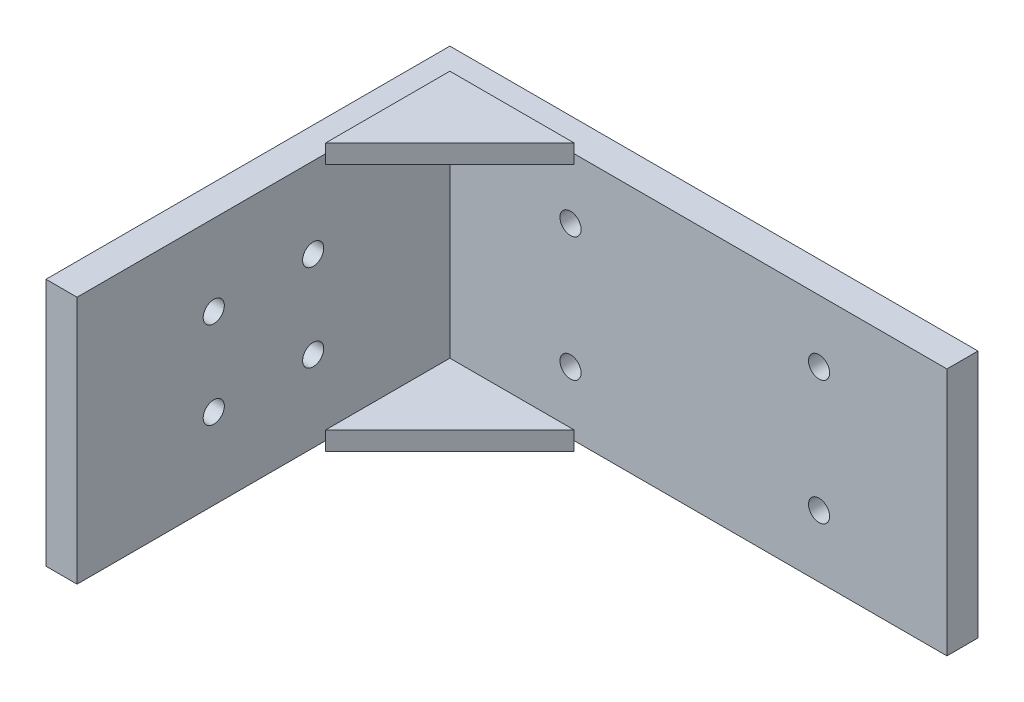
ISO-10303-21;
HEADER;
FILE_DESCRIPTION(('STEP AP214'),'2;1');
FILE_NAME('part.step','',(''),(''),'','','');
FILE_SCHEMA(('AUTOMOTIVE_DESIGN { 1 0 10303 214 1 1 1 1 }'));
ENDSEC;
DATA;
#1=APPLICATION_CONTEXT('core data for automotive mechanical design processes');
#2=APPLICATION_PROTOCOL_DEFINITION('international standard','automotive_design',2000,#1);
#3=PRODUCT_CONTEXT('',#1,'mechanical');
#4=PRODUCT('Part','Part','',(#3));
#5=PRODUCT_RELATED_PRODUCT_CATEGORY('part','',(#4));
#6=PRODUCT_DEFINITION_FORMATION('','',#4);
#7=PRODUCT_DEFINITION_CONTEXT('part definition',#1,'design');
#8=PRODUCT_DEFINITION('design','',#6,#7);
#9=PRODUCT_DEFINITION_SHAPE('','',#8);
#10=(LENGTH_UNIT() NAMED_UNIT(*) SI_UNIT(.MILLI.,.METRE.));
#11=(NAMED_UNIT(*) PLANE_ANGLE_UNIT() SI_UNIT($,.RADIAN.));
#12=(NAMED_UNIT(*) SI_UNIT($,.STERADIAN.) SOLID_ANGLE_UNIT());
#13=UNCERTAINTY_MEASURE_WITH_UNIT(LENGTH_MEASURE(1.E-05),#10,'distance_accuracy_value','');
#14=(GEOMETRIC_REPRESENTATION_CONTEXT(3) GLOBAL_UNCERTAINTY_ASSIGNED_CONTEXT((#13)) GLOBAL_UNIT_ASSIGNED_CONTEXT((#10,
#11,#12)) REPRESENTATION_CONTEXT('',''));
#15=CARTESIAN_POINT('',(0.,0.,0.));
#16=DIRECTION('',(0.,0.,1.));
#17=DIRECTION('',(1.,0.,0.));
#18=AXIS2_PLACEMENT_3D('',#15,#16,#17);
#19=CARTESIAN_POINT('',(0.,1.5,5.));
#20=DIRECTION('',(1.,0.,0.));
#21=DIRECTION('',(0.,0.,-1.));
#22=AXIS2_PLACEMENT_3D('',#19,#20,#21);
#23=PLANE('',#22);
#24=DIRECTION('',(0.,0.,1.));
#25=VECTOR('',#24,1.);
#26=CARTESIAN_POINT('',(0.,-1.5,5.));
#27=LINE('',#26,#25);
#28=CARTESIAN_POINT('',(0.,-1.5,5.));
#29=VERTEX_POINT('',#28);
#30=CARTESIAN_POINT('',(0.,-1.5,25.));
#31=VERTEX_POINT('',#30);
#32=EDGE_CURVE('E97',#29,#31,#27,.T.);
#33=ORIENTED_EDGE('',*,*,#32,.T.);
#34=DIRECTION('',(0.,-1.,0.));
#35=VECTOR('',#34,1.);
#36=CARTESIAN_POINT('',(0.,1.5,25.));
#37=LINE('',#36,#35);
#38=CARTESIAN_POINT('',(0.,1.5,25.));
#39=VERTEX_POINT('',#38);
#40=EDGE_CURVE('E12',#39,#31,#37,.T.);
#41=ORIENTED_EDGE('',*,*,#40,.F.);
#42=DIRECTION('',(0.,0.,1.));
#43=VECTOR('',#42,1.);
#44=CARTESIAN_POINT('',(0.,1.5,5.));
#45=LINE('',#44,#43);
#46=CARTESIAN_POINT('',(0.,1.5,5.));
#47=VERTEX_POINT('',#46);
#48=EDGE_CURVE('E89',#47,#39,#45,.T.);
#49=ORIENTED_EDGE('',*,*,#48,.F.);
#50=DIRECTION('',(0.,-1.,0.));
#51=VECTOR('',#50,1.);
#52=CARTESIAN_POINT('',(0.,1.5,5.));
#53=LINE('',#52,#51);
#54=EDGE_CURVE('E71',#47,#29,#53,.T.);
#55=ORIENTED_EDGE('',*,*,#54,.T.);
#56=EDGE_LOOP('',(#33,#41,#49,#55));
#57=FACE_BOUND('',#56,.T.);
#58=ADVANCED_FACE('F55',(#57),#23,.F.);
#59=CARTESIAN_POINT('',(20.,1.5,5.));
#60=DIRECTION('',(0.707106781186548,0.,0.707106781186547));
#61=DIRECTION('',(0.707106781186547,0.,-0.707106781186548));
#62=AXIS2_PLACEMENT_3D('',#59,#60,#61);
#63=PLANE('',#62);
#64=DIRECTION('',(-0.707106781186547,0.,0.707106781186548));
#65=VECTOR('',#64,1.);
#66=CARTESIAN_POINT('',(20.,-1.5,5.));
#67=LINE('',#66,#65);
#68=CARTESIAN_POINT('',(20.,-1.5,5.));
#69=VERTEX_POINT('',#68);
#70=EDGE_CURVE('E105',#69,#31,#67,.T.);
#71=ORIENTED_EDGE('',*,*,#70,.F.);
#72=DIRECTION('',(0.,-1.,0.));
#73=VECTOR('',#72,1.);
#74=CARTESIAN_POINT('',(20.,1.5,5.));
#75=LINE('',#74,#73);
#76=CARTESIAN_POINT('',(20.,1.5,5.));
#77=VERTEX_POINT('',#76);
#78=EDGE_CURVE('E63',#77,#69,#75,.T.);
#79=ORIENTED_EDGE('',*,*,#78,.F.);
#80=DIRECTION('',(-0.707106781186547,0.,0.707106781186548));
#81=VECTOR('',#80,1.);
#82=CARTESIAN_POINT('',(20.,1.5,5.));
#83=LINE('',#82,#81);
#84=EDGE_CURVE('E93',#77,#39,#83,.T.);
#85=ORIENTED_EDGE('',*,*,#84,.T.);
#86=ORIENTED_EDGE('',*,*,#40,.T.);
#87=EDGE_LOOP('',(#71,#79,#85,#86));
#88=FACE_BOUND('',#87,.T.);
#89=ADVANCED_FACE('F100',(#88),#63,.T.);
#90=CARTESIAN_POINT('',(0.,1.5,5.));
#91=DIRECTION('',(0.,0.,-1.));
#92=DIRECTION('',(-1.,0.,0.));
#93=AXIS2_PLACEMENT_3D('',#90,#91,#92);
#94=PLANE('',#93);
#95=DIRECTION('',(1.,0.,0.));
#96=VECTOR('',#95,1.);
#97=CARTESIAN_POINT('',(0.,-1.5,5.));
#98=LINE('',#97,#96);
#99=EDGE_CURVE('E95',#29,#69,#98,.T.);
#100=ORIENTED_EDGE('',*,*,#99,.F.);
#101=ORIENTED_EDGE('',*,*,#54,.F.);
#102=DIRECTION('',(1.,0.,0.));
#103=VECTOR('',#102,1.);
#104=CARTESIAN_POINT('',(0.,1.5,5.));
#105=LINE('',#104,#103);
#106=EDGE_CURVE('E94',#47,#77,#105,.T.);
#107=ORIENTED_EDGE('',*,*,#106,.T.);
#108=ORIENTED_EDGE('',*,*,#78,.T.);
#109=EDGE_LOOP('',(#100,#101,#107,#108));
#110=FACE_BOUND('',#109,.T.);
#111=ADVANCED_FACE('F111',(#110),#94,.T.);
#112=CARTESIAN_POINT('',(0.,1.5,0.));
#113=DIRECTION('',(0.,1.,0.));
#114=DIRECTION('',(0.,0.,1.));
#115=AXIS2_PLACEMENT_3D('',#112,#113,#114);
#116=PLANE('',#115);
#117=ORIENTED_EDGE('',*,*,#48,.T.);
#118=ORIENTED_EDGE('',*,*,#84,.F.);
#119=ORIENTED_EDGE('',*,*,#106,.F.);
#120=EDGE_LOOP('',(#117,#118,#119));
#121=FACE_BOUND('',#120,.T.);
#122=ADVANCED_FACE('F91',(#121),#116,.T.);
#123=CARTESIAN_POINT('',(0.,-1.5,0.));
#124=DIRECTION('',(0.,1.,0.));
#125=DIRECTION('',(0.,0.,1.));
#126=AXIS2_PLACEMENT_3D('',#123,#124,#125);
#127=PLANE('',#126);
#128=ORIENTED_EDGE('',*,*,#32,.F.);
#129=ORIENTED_EDGE('',*,*,#99,.T.);
#130=ORIENTED_EDGE('',*,*,#70,.T.);
#131=EDGE_LOOP('',(#128,#129,#130));
#132=FACE_BOUND('',#131,.T.);
#133=ADVANCED_FACE('F110',(#132),#127,.F.);
#134=CLOSED_SHELL('',(#58,#89,#111,#122,#133));
#135=MANIFOLD_SOLID_BREP('B2',#134);
#136=CARTESIAN_POINT('',(0.,0.,5.));
#137=DIRECTION('',(0.,0.,1.));
#138=DIRECTION('',(1.,0.,0.));
#139=AXIS2_PLACEMENT_3D('',#136,#137,#138);
#140=PLANE('',#139);
#141=CARTESIAN_POINT('',(19.4187387281831,-10.,5.));
#142=DIRECTION('',(0.,0.,1.));
#143=DIRECTION('',(1.,0.,0.));
#144=AXIS2_PLACEMENT_3D('',#141,#142,#143);
#145=CIRCLE('',#144,1.7);
#146=CARTESIAN_POINT('',(21.1187387281831,-10.,5.));
#147=VERTEX_POINT('',#146);
#148=EDGE_CURVE('E345',#147,#147,#145,.T.);
#149=ORIENTED_EDGE('',*,*,#148,.F.);
#150=EDGE_LOOP('',(#149));
#151=FACE_BOUND('',#150,.T.);
#152=CARTESIAN_POINT('',(19.4187387281831,-30.,5.));
#153=DIRECTION('',(0.,0.,1.));
#154=DIRECTION('',(1.,0.,0.));
#155=AXIS2_PLACEMENT_3D('',#152,#153,#154);
#156=CIRCLE('',#155,1.7);
#157=CARTESIAN_POINT('',(21.1187387281831,-30.,5.));
#158=VERTEX_POINT('',#157);
#159=EDGE_CURVE('E349',#158,#158,#156,.F.);
#160=ORIENTED_EDGE('',*,*,#159,.T.);
#161=EDGE_LOOP('',(#160));
#162=FACE_BOUND('',#161,.T.);
#163=CARTESIAN_POINT('',(59.4187387281831,-30.,5.));
#164=DIRECTION('',(0.,0.,1.));
#165=DIRECTION('',(1.,0.,0.));
#166=AXIS2_PLACEMENT_3D('',#163,#164,#165);
#167=CIRCLE('',#166,1.7);
#168=CARTESIAN_POINT('',(61.1187387281831,-30.,5.));
#169=VERTEX_POINT('',#168);
#170=EDGE_CURVE('E369',#169,#169,#167,.T.);
#171=ORIENTED_EDGE('',*,*,#170,.F.);
#172=EDGE_LOOP('',(#171));
#173=FACE_BOUND('',#172,.T.);
#174=CARTESIAN_POINT('',(59.4187387281831,-10.,5.));
#175=DIRECTION('',(0.,0.,1.));
#176=DIRECTION('',(1.,0.,0.));
#177=AXIS2_PLACEMENT_3D('',#174,#175,#176);
#178=CIRCLE('',#177,1.7);
#179=CARTESIAN_POINT('',(61.1187387281831,-10.,5.));
#180=VERTEX_POINT('',#179);
#181=EDGE_CURVE('E373',#180,#180,#178,.F.);
#182=ORIENTED_EDGE('',*,*,#181,.T.);
#183=EDGE_LOOP('',(#182));
#184=FACE_BOUND('',#183,.T.);
#185=DIRECTION('',(1.,0.,0.));
#186=VECTOR('',#185,1.);
#187=CARTESIAN_POINT('',(0.,-38.5,5.));
#188=LINE('',#187,#186);
#189=CARTESIAN_POINT('',(0.,-38.5,5.));
#190=VERTEX_POINT('',#189);
#191=CARTESIAN_POINT('',(20.,-38.5,5.));
#192=VERTEX_POINT('',#191);
#193=EDGE_CURVE('E169',#190,#192,#188,.T.);
#194=ORIENTED_EDGE('',*,*,#193,.T.);
#195=DIRECTION('',(0.,1.,0.));
#196=VECTOR('',#195,1.);
#197=CARTESIAN_POINT('',(20.,-41.5,5.));
#198=LINE('',#197,#196);
#199=CARTESIAN_POINT('',(20.,-40.,5.));
#200=VERTEX_POINT('',#199);
#201=EDGE_CURVE('E173',#200,#192,#198,.T.);
#202=ORIENTED_EDGE('',*,*,#201,.F.);
#203=DIRECTION('',(1.,0.,0.));
#204=VECTOR('',#203,1.);
#205=CARTESIAN_POINT('',(0.,-40.,5.));
#206=LINE('',#205,#204);
#207=CARTESIAN_POINT('',(80.,-40.,5.));
#208=VERTEX_POINT('',#207);
#209=EDGE_CURVE('E365',#200,#208,#206,.T.);
#210=ORIENTED_EDGE('',*,*,#209,.T.);
#211=DIRECTION('',(0.,-1.,0.));
#212=VECTOR('',#211,1.);
#213=CARTESIAN_POINT('',(80.,0.,5.));
#214=LINE('',#213,#212);
#215=CARTESIAN_POINT('',(80.,0.,5.));
#216=VERTEX_POINT('',#215);
#217=EDGE_CURVE('E354',#216,#208,#214,.T.);
#218=ORIENTED_EDGE('',*,*,#217,.F.);
#219=DIRECTION('',(1.,0.,0.));
#220=VECTOR('',#219,1.);
#221=CARTESIAN_POINT('',(0.,0.,5.));
#222=LINE('',#221,#220);
#223=CARTESIAN_POINT('',(0.,0.,5.));
#224=VERTEX_POINT('',#223);
#225=EDGE_CURVE('E358',#224,#216,#222,.T.);
#226=ORIENTED_EDGE('',*,*,#225,.F.);
#227=DIRECTION('',(0.,-1.,0.));
#228=VECTOR('',#227,1.);
#229=CARTESIAN_POINT('',(0.,0.,5.));
#230=LINE('',#229,#228);
#231=EDGE_CURVE('E362',#224,#190,#230,.T.);
#232=ORIENTED_EDGE('',*,*,#231,.T.);
#233=EDGE_LOOP('',(#194,#202,#210,#218,#226,#232));
#234=FACE_BOUND('',#233,.T.);
#235=ADVANCED_FACE('F153',(#151,#162,#173,#184,#234),#140,.T.);
#236=CARTESIAN_POINT('',(0.,0.,0.));
#237=DIRECTION('',(-1.,0.,0.));
#238=DIRECTION('',(0.,-1.,0.));
#239=AXIS2_PLACEMENT_3D('',#236,#237,#238);
#240=PLANE('',#239);
#241=DIRECTION('',(0.,1.,0.));
#242=VECTOR('',#241,1.);
#243=CARTESIAN_POINT('',(0.,0.,5.));
#244=LINE('',#243,#242);
#245=CARTESIAN_POINT('',(0.,-40.0044662647484,5.));
#246=VERTEX_POINT('',#245);
#247=CARTESIAN_POINT('',(0.,-40.,5.));
#248=VERTEX_POINT('',#247);
#249=EDGE_CURVE('E53',#246,#248,#244,.T.);
#250=ORIENTED_EDGE('',*,*,#249,.F.);
#251=DIRECTION('',(0.,0.,1.));
#252=VECTOR('',#251,1.);
#253=CARTESIAN_POINT('',(0.,-40.0044662647484,0.));
#254=LINE('',#253,#252);
#255=CARTESIAN_POINT('',(0.,-40.0044662647484,0.));
#256=VERTEX_POINT('',#255);
#257=EDGE_CURVE('E323',#256,#246,#254,.T.);
#258=ORIENTED_EDGE('',*,*,#257,.F.);
#259=DIRECTION('',(0.,-1.,0.));
#260=VECTOR('',#259,1.);
#261=CARTESIAN_POINT('',(0.,0.,0.));
#262=LINE('',#261,#260);
#263=CARTESIAN_POINT('',(0.,-40.,0.));
#264=VERTEX_POINT('',#263);
#265=EDGE_CURVE('E303',#264,#256,#262,.T.);
#266=ORIENTED_EDGE('',*,*,#265,.F.);
#267=DIRECTION('',(0.,0.,-1.));
#268=VECTOR('',#267,1.);
#269=CARTESIAN_POINT('',(0.,-40.,5.));
#270=LINE('',#269,#268);
#271=EDGE_CURVE('E406',#248,#264,#270,.T.);
#272=ORIENTED_EDGE('',*,*,#271,.F.);
#273=EDGE_LOOP('',(#250,#258,#266,#272));
#274=FACE_BOUND('',#273,.T.);
#275=ADVANCED_FACE('F446',(#274),#240,.F.);
#276=CARTESIAN_POINT('',(0.,-13.0022331323742,43.));
#277=DIRECTION('',(1.,0.,0.));
#278=DIRECTION('',(0.,1.,0.));
#279=AXIS2_PLACEMENT_3D('',#276,#277,#278);
#280=CIRCLE('',#279,1.7);
#281=CARTESIAN_POINT('',(0.,-11.3022331323742,43.));
#282=VERTEX_POINT('',#281);
#283=EDGE_CURVE('E280',#282,#282,#280,.T.);
#284=ORIENTED_EDGE('',*,*,#283,.F.);
#285=EDGE_LOOP('',(#284));
#286=FACE_BOUND('',#285,.T.);
#287=CARTESIAN_POINT('',(0.,-13.0022331323742,27.));
#288=DIRECTION('',(1.,0.,0.));
#289=DIRECTION('',(0.,-1.,0.));
#290=AXIS2_PLACEMENT_3D('',#287,#288,#289);
#291=CIRCLE('',#290,1.7);
#292=CARTESIAN_POINT('',(0.,-14.7022331323742,27.));
#293=VERTEX_POINT('',#292);
#294=EDGE_CURVE('E276',#293,#293,#291,.T.);
#295=ORIENTED_EDGE('',*,*,#294,.F.);
#296=EDGE_LOOP('',(#295));
#297=FACE_BOUND('',#296,.T.);
#298=CARTESIAN_POINT('',(0.,-27.0022331323742,27.));
#299=DIRECTION('',(1.,0.,0.));
#300=DIRECTION('',(0.,1.,0.));
#301=AXIS2_PLACEMENT_3D('',#298,#299,#300);
#302=CIRCLE('',#301,1.7);
#303=CARTESIAN_POINT('',(0.,-25.3022331323742,27.));
#304=VERTEX_POINT('',#303);
#305=EDGE_CURVE('E271',#304,#304,#302,.T.);
#306=ORIENTED_EDGE('',*,*,#305,.F.);
#307=EDGE_LOOP('',(#306));
#308=FACE_BOUND('',#307,.T.);
#309=CARTESIAN_POINT('',(0.,-27.0022331323742,43.));
#310=DIRECTION('',(1.,0.,0.));
#311=DIRECTION('',(0.,-1.,0.));
#312=AXIS2_PLACEMENT_3D('',#309,#310,#311);
#313=CIRCLE('',#312,1.7);
#314=CARTESIAN_POINT('',(0.,-28.7022331323742,43.));
#315=VERTEX_POINT('',#314);
#316=EDGE_CURVE('E266',#315,#315,#313,.T.);
#317=ORIENTED_EDGE('',*,*,#316,.F.);
#318=EDGE_LOOP('',(#317));
#319=FACE_BOUND('',#318,.T.);
#320=DIRECTION('',(0.,-1.,0.));
#321=VECTOR('',#320,1.);
#322=CARTESIAN_POINT('',(0.,0.,25.));
#323=LINE('',#322,#321);
#324=CARTESIAN_POINT('',(0.,-38.5,25.));
#325=VERTEX_POINT('',#324);
#326=CARTESIAN_POINT('',(0.,-40.0044662647484,25.));
#327=VERTEX_POINT('',#326);
#328=EDGE_CURVE('E162',#325,#327,#323,.T.);
#329=ORIENTED_EDGE('',*,*,#328,.F.);
#330=DIRECTION('',(0.,0.,-1.));
#331=VECTOR('',#330,1.);
#332=CARTESIAN_POINT('',(0.,-38.5,25.));
#333=LINE('',#332,#331);
#334=EDGE_CURVE('E430',#325,#190,#333,.T.);
#335=ORIENTED_EDGE('',*,*,#334,.T.);
#336=ORIENTED_EDGE('',*,*,#231,.F.);
#337=DIRECTION('',(0.,0.,-1.));
#338=VECTOR('',#337,1.);
#339=CARTESIAN_POINT('',(0.,0.,0.));
#340=LINE('',#339,#338);
#341=CARTESIAN_POINT('',(0.,0.,65.));
#342=VERTEX_POINT('',#341);
#343=EDGE_CURVE('E309',#342,#224,#340,.T.);
#344=ORIENTED_EDGE('',*,*,#343,.F.);
#345=DIRECTION('',(0.,1.,0.));
#346=VECTOR('',#345,1.);
#347=CARTESIAN_POINT('',(0.,0.,65.));
#348=LINE('',#347,#346);
#349=CARTESIAN_POINT('',(0.,-40.0044662647484,65.));
#350=VERTEX_POINT('',#349);
#351=EDGE_CURVE('E327',#350,#342,#348,.T.);
#352=ORIENTED_EDGE('',*,*,#351,.F.);
#353=EDGE_CURVE('E322',#327,#350,#254,.T.);
#354=ORIENTED_EDGE('',*,*,#353,.F.);
#355=EDGE_LOOP('',(#329,#335,#336,#344,#352,#354));
#356=FACE_BOUND('',#355,.T.);
#357=ADVANCED_FACE('F432',(#286,#297,#308,#319,#356),#240,.F.);
#358=CARTESIAN_POINT('',(80.,0.,5.));
#359=DIRECTION('',(1.,0.,0.));
#360=DIRECTION('',(0.,0.,-1.));
#361=AXIS2_PLACEMENT_3D('',#358,#359,#360);
#362=PLANE('',#361);
#363=DIRECTION('',(0.,-1.,0.));
#364=VECTOR('',#363,1.);
#365=CARTESIAN_POINT('',(80.,0.,0.));
#366=LINE('',#365,#364);
#367=CARTESIAN_POINT('',(80.,0.,0.));
#368=VERTEX_POINT('',#367);
#369=CARTESIAN_POINT('',(80.,-40.,0.));
#370=VERTEX_POINT('',#369);
#371=EDGE_CURVE('E385',#368,#370,#366,.T.);
#372=ORIENTED_EDGE('',*,*,#371,.F.);
#373=DIRECTION('',(0.,0.,-1.));
#374=VECTOR('',#373,1.);
#375=CARTESIAN_POINT('',(80.,0.,5.));
#376=LINE('',#375,#374);
#377=EDGE_CURVE('E410',#216,#368,#376,.T.);
#378=ORIENTED_EDGE('',*,*,#377,.F.);
#379=ORIENTED_EDGE('',*,*,#217,.T.);
#380=DIRECTION('',(0.,0.,-1.));
#381=VECTOR('',#380,1.);
#382=CARTESIAN_POINT('',(80.,-40.,5.));
#383=LINE('',#382,#381);
#384=EDGE_CURVE('E377',#208,#370,#383,.T.);
#385=ORIENTED_EDGE('',*,*,#384,.T.);
#386=EDGE_LOOP('',(#372,#378,#379,#385));
#387=FACE_BOUND('',#386,.T.);
#388=ADVANCED_FACE('F481',(#387),#362,.T.);
#389=CARTESIAN_POINT('',(0.,0.,5.));
#390=DIRECTION('',(0.,1.,0.));
#391=DIRECTION('',(0.,0.,1.));
#392=AXIS2_PLACEMENT_3D('',#389,#390,#391);
#393=PLANE('',#392);
#394=DIRECTION('',(1.,0.,0.));
#395=VECTOR('',#394,1.);
#396=CARTESIAN_POINT('',(0.,0.,0.));
#397=LINE('',#396,#395);
#398=CARTESIAN_POINT('',(-5.,0.,0.));
#399=VERTEX_POINT('',#398);
#400=EDGE_CURVE('E389',#399,#368,#397,.T.);
#401=ORIENTED_EDGE('',*,*,#400,.F.);
#402=DIRECTION('',(0.,0.,-1.));
#403=VECTOR('',#402,1.);
#404=CARTESIAN_POINT('',(-5.,0.,0.));
#405=LINE('',#404,#403);
#406=CARTESIAN_POINT('',(-5.,0.,65.));
#407=VERTEX_POINT('',#406);
#408=EDGE_CURVE('E315',#407,#399,#405,.T.);
#409=ORIENTED_EDGE('',*,*,#408,.F.);
#410=DIRECTION('',(1.,0.,0.));
#411=VECTOR('',#410,1.);
#412=CARTESIAN_POINT('',(-5.,0.,65.));
#413=LINE('',#412,#411);
#414=EDGE_CURVE('E319',#407,#342,#413,.T.);
#415=ORIENTED_EDGE('',*,*,#414,.T.);
#416=ORIENTED_EDGE('',*,*,#343,.T.);
#417=ORIENTED_EDGE('',*,*,#225,.T.);
#418=ORIENTED_EDGE('',*,*,#377,.T.);
#419=EDGE_LOOP('',(#401,#409,#415,#416,#417,#418));
#420=FACE_BOUND('',#419,.T.);
#421=ADVANCED_FACE('F473',(#420),#393,.T.);
#422=CARTESIAN_POINT('',(59.4187387281831,-30.,5.));
#423=DIRECTION('',(0.,0.,-1.));
#424=DIRECTION('',(-1.,0.,0.));
#425=AXIS2_PLACEMENT_3D('',#422,#423,#424);
#426=CYLINDRICAL_SURFACE('',#425,1.7);
#427=ORIENTED_EDGE('',*,*,#170,.T.);
#428=EDGE_LOOP('',(#427));
#429=FACE_BOUND('',#428,.T.);
#430=CARTESIAN_POINT('',(59.4187387281831,-30.,0.));
#431=DIRECTION('',(0.,0.,1.));
#432=DIRECTION('',(1.,0.,0.));
#433=AXIS2_PLACEMENT_3D('',#430,#431,#432);
#434=CIRCLE('',#433,1.7);
#435=CARTESIAN_POINT('',(61.1187387281831,-30.,0.));
#436=VERTEX_POINT('',#435);
#437=EDGE_CURVE('E397',#436,#436,#434,.T.);
#438=ORIENTED_EDGE('',*,*,#437,.F.);
#439=EDGE_LOOP('',(#438));
#440=FACE_BOUND('',#439,.T.);
#441=ADVANCED_FACE('F469',(#429,#440),#426,.F.);
#442=CARTESIAN_POINT('',(0.,-40.,5.));
#443=DIRECTION('',(0.,1.,0.));
#444=DIRECTION('',(0.,0.,1.));
#445=AXIS2_PLACEMENT_3D('',#442,#443,#444);
#446=PLANE('',#445);
#447=DIRECTION('',(1.,0.,0.));
#448=VECTOR('',#447,1.);
#449=CARTESIAN_POINT('',(0.,-40.,0.));
#450=LINE('',#449,#448);
#451=EDGE_CURVE('E393',#264,#370,#450,.T.);
#452=ORIENTED_EDGE('',*,*,#451,.T.);
#453=ORIENTED_EDGE('',*,*,#384,.F.);
#454=ORIENTED_EDGE('',*,*,#209,.F.);
#455=EDGE_CURVE('E366',#248,#200,#206,.T.);
#456=ORIENTED_EDGE('',*,*,#455,.F.);
#457=ORIENTED_EDGE('',*,*,#271,.T.);
#458=EDGE_LOOP('',(#452,#453,#454,#456,#457));
#459=FACE_BOUND('',#458,.T.);
#460=ADVANCED_FACE('F472',(#459),#446,.F.);
#461=CARTESIAN_POINT('',(19.4187387281831,-30.,5.));
#462=DIRECTION('',(0.,0.,-1.));
#463=DIRECTION('',(-1.,0.,0.));
#464=AXIS2_PLACEMENT_3D('',#461,#462,#463);
#465=CYLINDRICAL_SURFACE('',#464,1.7);
#466=ORIENTED_EDGE('',*,*,#159,.F.);
#467=EDGE_LOOP('',(#466));
#468=FACE_BOUND('',#467,.T.);
#469=CARTESIAN_POINT('',(19.4187387281831,-30.,0.));
#470=DIRECTION('',(0.,0.,1.));
#471=DIRECTION('',(1.,0.,0.));
#472=AXIS2_PLACEMENT_3D('',#469,#470,#471);
#473=CIRCLE('',#472,1.7);
#474=CARTESIAN_POINT('',(21.1187387281831,-30.,0.));
#475=VERTEX_POINT('',#474);
#476=EDGE_CURVE('E381',#475,#475,#473,.F.);
#477=ORIENTED_EDGE('',*,*,#476,.T.);
#478=EDGE_LOOP('',(#477));
#479=FACE_BOUND('',#478,.T.);
#480=ADVANCED_FACE('F477',(#468,#479),#465,.F.);
#481=CARTESIAN_POINT('',(19.4187387281831,-10.,5.));
#482=DIRECTION('',(0.,0.,-1.));
#483=DIRECTION('',(-1.,0.,0.));
#484=AXIS2_PLACEMENT_3D('',#481,#482,#483);
#485=CYLINDRICAL_SURFACE('',#484,1.7);
#486=ORIENTED_EDGE('',*,*,#148,.T.);
#487=EDGE_LOOP('',(#486));
#488=FACE_BOUND('',#487,.T.);
#489=CARTESIAN_POINT('',(19.4187387281831,-10.,0.));
#490=DIRECTION('',(0.,0.,1.));
#491=DIRECTION('',(1.,0.,0.));
#492=AXIS2_PLACEMENT_3D('',#489,#490,#491);
#493=CIRCLE('',#492,1.7);
#494=CARTESIAN_POINT('',(21.1187387281831,-10.,0.));
#495=VERTEX_POINT('',#494);
#496=EDGE_CURVE('E344',#495,#495,#493,.T.);
#497=ORIENTED_EDGE('',*,*,#496,.F.);
#498=EDGE_LOOP('',(#497));
#499=FACE_BOUND('',#498,.T.);
#500=ADVANCED_FACE('F155',(#488,#499),#485,.F.);
#501=CARTESIAN_POINT('',(59.4187387281831,-10.,5.));
#502=DIRECTION('',(0.,0.,-1.));
#503=DIRECTION('',(-1.,0.,0.));
#504=AXIS2_PLACEMENT_3D('',#501,#502,#503);
#505=CYLINDRICAL_SURFACE('',#504,1.7);
#506=ORIENTED_EDGE('',*,*,#181,.F.);
#507=EDGE_LOOP('',(#506));
#508=FACE_BOUND('',#507,.T.);
#509=CARTESIAN_POINT('',(59.4187387281831,-10.,0.));
#510=DIRECTION('',(0.,0.,1.));
#511=DIRECTION('',(1.,0.,0.));
#512=AXIS2_PLACEMENT_3D('',#509,#510,#511);
#513=CIRCLE('',#512,1.7);
#514=CARTESIAN_POINT('',(61.1187387281831,-10.,0.));
#515=VERTEX_POINT('',#514);
#516=EDGE_CURVE('E350',#515,#515,#513,.F.);
#517=ORIENTED_EDGE('',*,*,#516,.T.);
#518=EDGE_LOOP('',(#517));
#519=FACE_BOUND('',#518,.T.);
#520=ADVANCED_FACE('F464',(#508,#519),#505,.F.);
#521=CARTESIAN_POINT('',(0.,0.,0.));
#522=DIRECTION('',(0.,0.,1.));
#523=DIRECTION('',(1.,0.,0.));
#524=AXIS2_PLACEMENT_3D('',#521,#522,#523);
#525=PLANE('',#524);
#526=ORIENTED_EDGE('',*,*,#496,.T.);
#527=EDGE_LOOP('',(#526));
#528=FACE_BOUND('',#527,.T.);
#529=ORIENTED_EDGE('',*,*,#476,.F.);
#530=EDGE_LOOP('',(#529));
#531=FACE_BOUND('',#530,.T.);
#532=ORIENTED_EDGE('',*,*,#371,.T.);
#533=ORIENTED_EDGE('',*,*,#451,.F.);
#534=ORIENTED_EDGE('',*,*,#265,.T.);
#535=DIRECTION('',(1.,0.,0.));
#536=VECTOR('',#535,1.);
#537=CARTESIAN_POINT('',(-4.99999999999999,-40.0044662647484,0.));
#538=LINE('',#537,#536);
#539=CARTESIAN_POINT('',(-4.99999999999999,-40.0044662647484,0.));
#540=VERTEX_POINT('',#539);
#541=EDGE_CURVE('E340',#540,#256,#538,.T.);
#542=ORIENTED_EDGE('',*,*,#541,.F.);
#543=DIRECTION('',(0.,-1.,0.));
#544=VECTOR('',#543,1.);
#545=CARTESIAN_POINT('',(-5.,0.,0.));
#546=LINE('',#545,#544);
#547=EDGE_CURVE('E304',#399,#540,#546,.T.);
#548=ORIENTED_EDGE('',*,*,#547,.F.);
#549=ORIENTED_EDGE('',*,*,#400,.T.);
#550=EDGE_LOOP('',(#532,#533,#534,#542,#548,#549));
#551=FACE_BOUND('',#550,.T.);
#552=ORIENTED_EDGE('',*,*,#437,.T.);
#553=EDGE_LOOP('',(#552));
#554=FACE_BOUND('',#553,.T.);
#555=ORIENTED_EDGE('',*,*,#516,.F.);
#556=EDGE_LOOP('',(#555));
#557=FACE_BOUND('',#556,.T.);
#558=ADVANCED_FACE('F461',(#528,#531,#551,#554,#557),#525,.F.);
#559=CARTESIAN_POINT('',(-4.99999999999999,-40.0044662647484,0.));
#560=DIRECTION('',(0.,1.,0.));
#561=DIRECTION('',(-1.,0.,0.));
#562=AXIS2_PLACEMENT_3D('',#559,#560,#561);
#563=PLANE('',#562);
#564=ORIENTED_EDGE('',*,*,#257,.T.);
#565=EDGE_CURVE('E264',#246,#327,#254,.T.);
#566=ORIENTED_EDGE('',*,*,#565,.T.);
#567=ORIENTED_EDGE('',*,*,#353,.T.);
#568=DIRECTION('',(1.,0.,0.));
#569=VECTOR('',#568,1.);
#570=CARTESIAN_POINT('',(-4.99999999999999,-40.0044662647484,65.));
#571=LINE('',#570,#569);
#572=CARTESIAN_POINT('',(-4.99999999999999,-40.0044662647484,65.));
#573=VERTEX_POINT('',#572);
#574=EDGE_CURVE('E336',#573,#350,#571,.T.);
#575=ORIENTED_EDGE('',*,*,#574,.F.);
#576=DIRECTION('',(0.,0.,1.));
#577=VECTOR('',#576,1.);
#578=CARTESIAN_POINT('',(-4.99999999999999,-40.0044662647484,0.));
#579=LINE('',#578,#577);
#580=EDGE_CURVE('E308',#540,#573,#579,.T.);
#581=ORIENTED_EDGE('',*,*,#580,.F.);
#582=ORIENTED_EDGE('',*,*,#541,.T.);
#583=EDGE_LOOP('',(#564,#566,#567,#575,#581,#582));
#584=FACE_BOUND('',#583,.T.);
#585=ADVANCED_FACE('F459',(#584),#563,.F.);
#586=CARTESIAN_POINT('',(-5.,0.,65.));
#587=DIRECTION('',(0.,0.,-1.));
#588=DIRECTION('',(0.,1.,0.));
#589=AXIS2_PLACEMENT_3D('',#586,#587,#588);
#590=PLANE('',#589);
#591=ORIENTED_EDGE('',*,*,#351,.T.);
#592=ORIENTED_EDGE('',*,*,#414,.F.);
#593=DIRECTION('',(0.,1.,0.));
#594=VECTOR('',#593,1.);
#595=CARTESIAN_POINT('',(-5.,0.,65.));
#596=LINE('',#595,#594);
#597=EDGE_CURVE('E312',#573,#407,#596,.T.);
#598=ORIENTED_EDGE('',*,*,#597,.F.);
#599=ORIENTED_EDGE('',*,*,#574,.T.);
#600=EDGE_LOOP('',(#591,#592,#598,#599));
#601=FACE_BOUND('',#600,.T.);
#602=ADVANCED_FACE('F518',(#601),#590,.F.);
#603=CARTESIAN_POINT('',(-5.,0.,0.));
#604=DIRECTION('',(-1.,0.,0.));
#605=DIRECTION('',(0.,-1.,0.));
#606=AXIS2_PLACEMENT_3D('',#603,#604,#605);
#607=PLANE('',#606);
#608=CARTESIAN_POINT('',(-5.,-27.0022331323742,43.));
#609=DIRECTION('',(-1.,0.,0.));
#610=DIRECTION('',(0.,-1.,0.));
#611=AXIS2_PLACEMENT_3D('',#608,#609,#610);
#612=CIRCLE('',#611,1.7);
#613=CARTESIAN_POINT('',(-5.,-28.7022331323742,43.));
#614=VERTEX_POINT('',#613);
#615=EDGE_CURVE('E299',#614,#614,#612,.T.);
#616=ORIENTED_EDGE('',*,*,#615,.F.);
#617=EDGE_LOOP('',(#616));
#618=FACE_BOUND('',#617,.T.);
#619=CARTESIAN_POINT('',(-5.,-27.0022331323742,27.));
#620=DIRECTION('',(-1.,0.,0.));
#621=DIRECTION('',(0.,-1.,0.));
#622=AXIS2_PLACEMENT_3D('',#619,#620,#621);
#623=CIRCLE('',#622,1.7);
#624=CARTESIAN_POINT('',(-5.,-28.7022331323742,27.));
#625=VERTEX_POINT('',#624);
#626=EDGE_CURVE('E295',#625,#625,#623,.T.);
#627=ORIENTED_EDGE('',*,*,#626,.F.);
#628=EDGE_LOOP('',(#627));
#629=FACE_BOUND('',#628,.T.);
#630=CARTESIAN_POINT('',(-5.,-13.0022331323742,27.));
#631=DIRECTION('',(-1.,0.,0.));
#632=DIRECTION('',(0.,-1.,0.));
#633=AXIS2_PLACEMENT_3D('',#630,#631,#632);
#634=CIRCLE('',#633,1.7);
#635=CARTESIAN_POINT('',(-5.,-14.7022331323742,27.));
#636=VERTEX_POINT('',#635);
#637=EDGE_CURVE('E291',#636,#636,#634,.T.);
#638=ORIENTED_EDGE('',*,*,#637,.F.);
#639=EDGE_LOOP('',(#638));
#640=FACE_BOUND('',#639,.T.);
#641=CARTESIAN_POINT('',(-5.,-13.0022331323742,43.));
#642=DIRECTION('',(-1.,0.,0.));
#643=DIRECTION('',(0.,-1.,0.));
#644=AXIS2_PLACEMENT_3D('',#641,#642,#643);
#645=CIRCLE('',#644,1.7);
#646=CARTESIAN_POINT('',(-5.,-14.7022331323742,43.));
#647=VERTEX_POINT('',#646);
#648=EDGE_CURVE('E287',#647,#647,#645,.T.);
#649=ORIENTED_EDGE('',*,*,#648,.F.);
#650=EDGE_LOOP('',(#649));
#651=FACE_BOUND('',#650,.T.);
#652=ORIENTED_EDGE('',*,*,#547,.T.);
#653=ORIENTED_EDGE('',*,*,#580,.T.);
#654=ORIENTED_EDGE('',*,*,#597,.T.);
#655=ORIENTED_EDGE('',*,*,#408,.T.);
#656=EDGE_LOOP('',(#652,#653,#654,#655));
#657=FACE_BOUND('',#656,.T.);
#658=ADVANCED_FACE('F513',(#618,#629,#640,#651,#657),#607,.T.);
#659=CARTESIAN_POINT('',(-10.,-13.0022331323742,43.));
#660=DIRECTION('',(1.,0.,0.));
#661=DIRECTION('',(0.,1.,0.));
#662=AXIS2_PLACEMENT_3D('',#659,#660,#661);
#663=CYLINDRICAL_SURFACE('',#662,1.7);
#664=ORIENTED_EDGE('',*,*,#648,.T.);
#665=EDGE_LOOP('',(#664));
#666=FACE_BOUND('',#665,.T.);
#667=ORIENTED_EDGE('',*,*,#283,.T.);
#668=EDGE_LOOP('',(#667));
#669=FACE_BOUND('',#668,.T.);
#670=ADVANCED_FACE('F523',(#666,#669),#663,.F.);
#671=CARTESIAN_POINT('',(-10.,-13.0022331323742,27.));
#672=DIRECTION('',(1.,0.,0.));
#673=DIRECTION('',(0.,1.,0.));
#674=AXIS2_PLACEMENT_3D('',#671,#672,#673);
#675=CYLINDRICAL_SURFACE('',#674,1.7);
#676=ORIENTED_EDGE('',*,*,#637,.T.);
#677=EDGE_LOOP('',(#676));
#678=FACE_BOUND('',#677,.T.);
#679=ORIENTED_EDGE('',*,*,#294,.T.);
#680=EDGE_LOOP('',(#679));
#681=FACE_BOUND('',#680,.T.);
#682=ADVANCED_FACE('F530',(#678,#681),#675,.F.);
#683=CARTESIAN_POINT('',(-10.,-27.0022331323742,27.));
#684=DIRECTION('',(1.,0.,0.));
#685=DIRECTION('',(0.,1.,0.));
#686=AXIS2_PLACEMENT_3D('',#683,#684,#685);
#687=CYLINDRICAL_SURFACE('',#686,1.7);
#688=ORIENTED_EDGE('',*,*,#626,.T.);
#689=EDGE_LOOP('',(#688));
#690=FACE_BOUND('',#689,.T.);
#691=ORIENTED_EDGE('',*,*,#305,.T.);
#692=EDGE_LOOP('',(#691));
#693=FACE_BOUND('',#692,.T.);
#694=ADVANCED_FACE('F534',(#690,#693),#687,.F.);
#695=CARTESIAN_POINT('',(-10.,-27.0022331323742,43.));
#696=DIRECTION('',(1.,0.,0.));
#697=DIRECTION('',(0.,1.,0.));
#698=AXIS2_PLACEMENT_3D('',#695,#696,#697);
#699=CYLINDRICAL_SURFACE('',#698,1.7);
#700=ORIENTED_EDGE('',*,*,#615,.T.);
#701=EDGE_LOOP('',(#700));
#702=FACE_BOUND('',#701,.T.);
#703=ORIENTED_EDGE('',*,*,#316,.T.);
#704=EDGE_LOOP('',(#703));
#705=FACE_BOUND('',#704,.T.);
#706=ADVANCED_FACE('F532',(#702,#705),#699,.F.);
#707=CARTESIAN_POINT('',(0.,-41.5,25.));
#708=DIRECTION('',(1.,0.,0.));
#709=DIRECTION('',(0.,0.,-1.));
#710=AXIS2_PLACEMENT_3D('',#707,#708,#709);
#711=PLANE('',#710);
#712=DIRECTION('',(0.,1.,0.));
#713=VECTOR('',#712,1.);
#714=CARTESIAN_POINT('',(0.,-41.5,25.));
#715=LINE('',#714,#713);
#716=CARTESIAN_POINT('',(0.,-41.5,25.));
#717=VERTEX_POINT('',#716);
#718=EDGE_CURVE('E417',#717,#327,#715,.T.);
#719=ORIENTED_EDGE('',*,*,#718,.T.);
#720=ORIENTED_EDGE('',*,*,#565,.F.);
#721=DIRECTION('',(0.,1.,0.));
#722=VECTOR('',#721,1.);
#723=CARTESIAN_POINT('',(0.,-41.5,5.));
#724=LINE('',#723,#722);
#725=CARTESIAN_POINT('',(0.,-41.5,5.));
#726=VERTEX_POINT('',#725);
#727=EDGE_CURVE('E243',#726,#246,#724,.T.);
#728=ORIENTED_EDGE('',*,*,#727,.F.);
#729=DIRECTION('',(0.,0.,-1.));
#730=VECTOR('',#729,1.);
#731=CARTESIAN_POINT('',(0.,-41.5,25.));
#732=LINE('',#731,#730);
#733=EDGE_CURVE('E251',#717,#726,#732,.T.);
#734=ORIENTED_EDGE('',*,*,#733,.F.);
#735=EDGE_LOOP('',(#719,#720,#728,#734));
#736=FACE_BOUND('',#735,.T.);
#737=ADVANCED_FACE('F262',(#736),#711,.F.);
#738=CARTESIAN_POINT('',(0.,-41.5,5.));
#739=DIRECTION('',(0.,0.,1.));
#740=DIRECTION('',(1.,0.,0.));
#741=AXIS2_PLACEMENT_3D('',#738,#739,#740);
#742=PLANE('',#741);
#743=ORIENTED_EDGE('',*,*,#249,.T.);
#744=ORIENTED_EDGE('',*,*,#455,.T.);
#745=CARTESIAN_POINT('',(20.,-41.5,5.));
#746=VERTEX_POINT('',#745);
#747=EDGE_CURVE('E246',#746,#200,#198,.T.);
#748=ORIENTED_EDGE('',*,*,#747,.F.);
#749=DIRECTION('',(1.,0.,0.));
#750=VECTOR('',#749,1.);
#751=CARTESIAN_POINT('',(0.,-41.5,5.));
#752=LINE('',#751,#750);
#753=EDGE_CURVE('E239',#726,#746,#752,.T.);
#754=ORIENTED_EDGE('',*,*,#753,.F.);
#755=ORIENTED_EDGE('',*,*,#727,.T.);
#756=EDGE_LOOP('',(#743,#744,#748,#754,#755));
#757=FACE_BOUND('',#756,.T.);
#758=ADVANCED_FACE('F241',(#757),#742,.F.);
#759=CARTESIAN_POINT('',(20.,-41.5,5.));
#760=DIRECTION('',(-0.707106781186548,0.,-0.707106781186547));
#761=DIRECTION('',(-0.707106781186547,0.,0.707106781186548));
#762=AXIS2_PLACEMENT_3D('',#759,#760,#761);
#763=PLANE('',#762);
#764=DIRECTION('',(-0.707106781186547,0.,0.707106781186548));
#765=VECTOR('',#764,1.);
#766=CARTESIAN_POINT('',(20.,-38.5,5.));
#767=LINE('',#766,#765);
#768=EDGE_CURVE('E259',#192,#325,#767,.T.);
#769=ORIENTED_EDGE('',*,*,#768,.T.);
#770=ORIENTED_EDGE('',*,*,#328,.T.);
#771=ORIENTED_EDGE('',*,*,#718,.F.);
#772=DIRECTION('',(-0.707106781186547,0.,0.707106781186548));
#773=VECTOR('',#772,1.);
#774=CARTESIAN_POINT('',(20.,-41.5,5.));
#775=LINE('',#774,#773);
#776=EDGE_CURVE('E250',#746,#717,#775,.T.);
#777=ORIENTED_EDGE('',*,*,#776,.F.);
#778=ORIENTED_EDGE('',*,*,#747,.T.);
#779=ORIENTED_EDGE('',*,*,#201,.T.);
#780=EDGE_LOOP('',(#769,#770,#771,#777,#778,#779));
#781=FACE_BOUND('',#780,.T.);
#782=ADVANCED_FACE('F416',(#781),#763,.F.);
#783=CARTESIAN_POINT('',(0.,-41.5,0.));
#784=DIRECTION('',(0.,-1.,0.));
#785=DIRECTION('',(0.,0.,-1.));
#786=AXIS2_PLACEMENT_3D('',#783,#784,#785);
#787=PLANE('',#786);
#788=ORIENTED_EDGE('',*,*,#733,.T.);
#789=ORIENTED_EDGE('',*,*,#753,.T.);
#790=ORIENTED_EDGE('',*,*,#776,.T.);
#791=EDGE_LOOP('',(#788,#789,#790));
#792=FACE_BOUND('',#791,.T.);
#793=ADVANCED_FACE('F254',(#792),#787,.T.);
#794=CARTESIAN_POINT('',(0.,-38.5,0.));
#795=DIRECTION('',(0.,-1.,0.));
#796=DIRECTION('',(0.,0.,-1.));
#797=AXIS2_PLACEMENT_3D('',#794,#795,#796);
#798=PLANE('',#797);
#799=ORIENTED_EDGE('',*,*,#334,.F.);
#800=ORIENTED_EDGE('',*,*,#768,.F.);
#801=ORIENTED_EDGE('',*,*,#193,.F.);
#802=EDGE_LOOP('',(#799,#800,#801));
#803=FACE_BOUND('',#802,.T.);
#804=ADVANCED_FACE('F437',(#803),#798,.F.);
#805=CLOSED_SHELL('',(#235,#275,#357,#388,#421,#441,#460,#480,#500,#520,#558,#585,#602,#658,
#670,#682,#694,#706,#737,#758,#782,#793,#804));
#806=MANIFOLD_SOLID_BREP('B6',#805);
#807=ADVANCED_BREP_SHAPE_REPRESENTATION('',(#18,#135,#806),#14);
#808=SHAPE_DEFINITION_REPRESENTATION(#9,#807);
ENDSEC;
END-ISO-10303-21;
